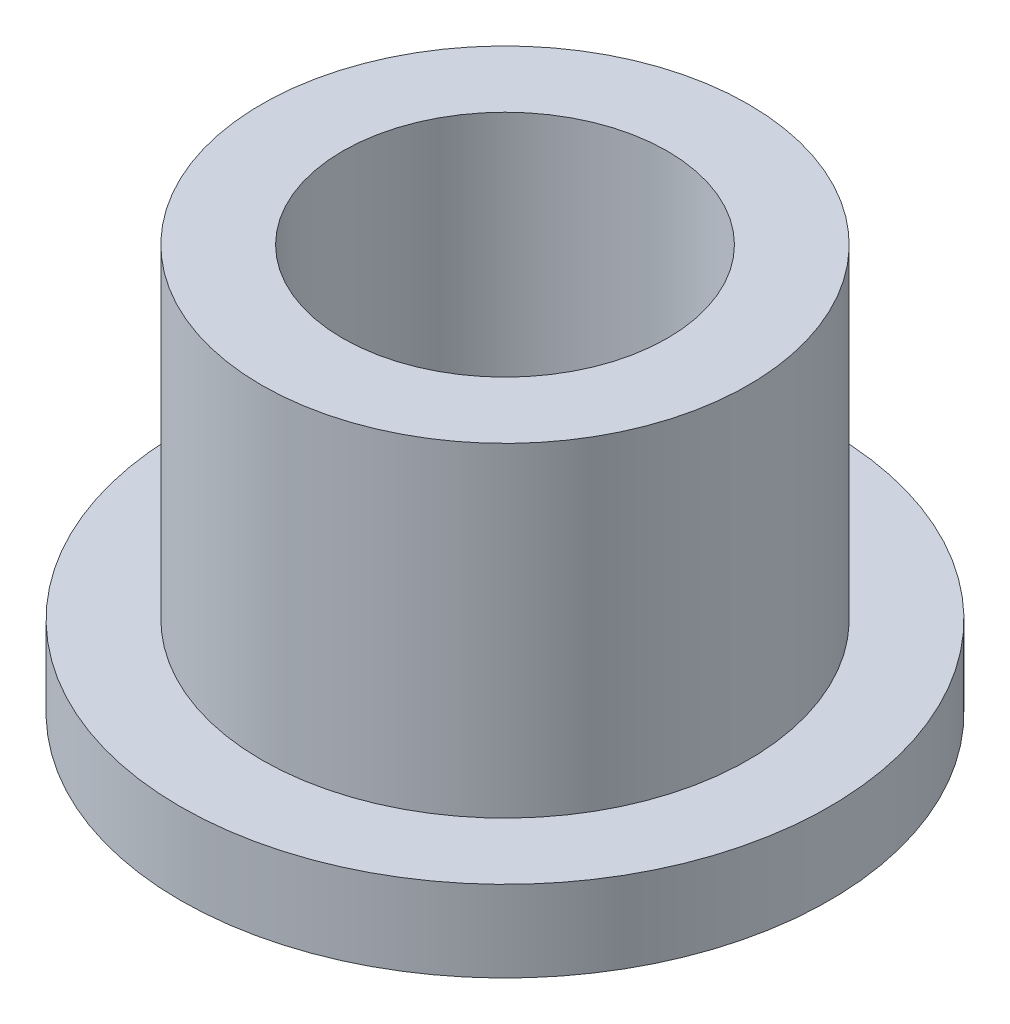
ISO-10303-21;
HEADER;
FILE_DESCRIPTION(('STEP AP214'),'2;1');
FILE_NAME('part.step','',(''),(''),'','','');
FILE_SCHEMA(('AUTOMOTIVE_DESIGN { 1 0 10303 214 1 1 1 1 }'));
ENDSEC;
DATA;
#1=APPLICATION_CONTEXT('core data for automotive mechanical design processes');
#2=APPLICATION_PROTOCOL_DEFINITION('international standard','automotive_design',2000,#1);
#3=PRODUCT_CONTEXT('',#1,'mechanical');
#4=PRODUCT('Part','Part','',(#3));
#5=PRODUCT_RELATED_PRODUCT_CATEGORY('part','',(#4));
#6=PRODUCT_DEFINITION_FORMATION('','',#4);
#7=PRODUCT_DEFINITION_CONTEXT('part definition',#1,'design');
#8=PRODUCT_DEFINITION('design','',#6,#7);
#9=PRODUCT_DEFINITION_SHAPE('','',#8);
#10=(LENGTH_UNIT() NAMED_UNIT(*) SI_UNIT(.MILLI.,.METRE.));
#11=(NAMED_UNIT(*) PLANE_ANGLE_UNIT() SI_UNIT($,.RADIAN.));
#12=(NAMED_UNIT(*) SI_UNIT($,.STERADIAN.) SOLID_ANGLE_UNIT());
#13=UNCERTAINTY_MEASURE_WITH_UNIT(LENGTH_MEASURE(1.E-05),#10,'distance_accuracy_value','');
#14=(GEOMETRIC_REPRESENTATION_CONTEXT(3) GLOBAL_UNCERTAINTY_ASSIGNED_CONTEXT((#13)) GLOBAL_UNIT_ASSIGNED_CONTEXT((#10,
#11,#12)) REPRESENTATION_CONTEXT('',''));
#15=CARTESIAN_POINT('',(0.,0.,0.));
#16=DIRECTION('',(0.,0.,1.));
#17=DIRECTION('',(1.,0.,0.));
#18=AXIS2_PLACEMENT_3D('',#15,#16,#17);
#19=CARTESIAN_POINT('',(0.,7.9375,0.));
#20=DIRECTION('',(0.,1.,0.));
#21=DIRECTION('',(0.,0.,1.));
#22=AXIS2_PLACEMENT_3D('',#19,#20,#21);
#23=PLANE('',#22);
#24=CARTESIAN_POINT('',(0.,7.9375,0.));
#25=DIRECTION('',(0.,1.,0.));
#26=DIRECTION('',(0.,0.,1.));
#27=AXIS2_PLACEMENT_3D('',#24,#25,#26);
#28=CIRCLE('',#27,4.7625);
#29=CARTESIAN_POINT('',(0.,7.9375,4.7625));
#30=VERTEX_POINT('',#29);
#31=EDGE_CURVE('E10',#30,#30,#28,.T.);
#32=ORIENTED_EDGE('',*,*,#31,.T.);
#33=EDGE_LOOP('',(#32));
#34=FACE_BOUND('',#33,.T.);
#35=CARTESIAN_POINT('',(0.,7.9375,0.));
#36=DIRECTION('',(0.,1.,0.));
#37=DIRECTION('',(0.,0.,1.));
#38=AXIS2_PLACEMENT_3D('',#35,#36,#37);
#39=CIRCLE('',#38,3.175);
#40=CARTESIAN_POINT('',(0.,7.9375,3.175));
#41=VERTEX_POINT('',#40);
#42=EDGE_CURVE('E37',#41,#41,#39,.T.);
#43=ORIENTED_EDGE('',*,*,#42,.F.);
#44=EDGE_LOOP('',(#43));
#45=FACE_BOUND('',#44,.T.);
#46=ADVANCED_FACE('F30',(#34,#45),#23,.T.);
#47=CARTESIAN_POINT('',(0.,0.,0.));
#48=DIRECTION('',(0.,1.,0.));
#49=DIRECTION('',(0.,0.,1.));
#50=AXIS2_PLACEMENT_3D('',#47,#48,#49);
#51=PLANE('',#50);
#52=CARTESIAN_POINT('',(0.,0.,0.));
#53=DIRECTION('',(0.,1.,0.));
#54=DIRECTION('',(0.,0.,1.));
#55=AXIS2_PLACEMENT_3D('',#52,#53,#54);
#56=CIRCLE('',#55,3.175);
#57=CARTESIAN_POINT('',(0.,0.,3.175));
#58=VERTEX_POINT('',#57);
#59=EDGE_CURVE('E41',#58,#58,#56,.T.);
#60=ORIENTED_EDGE('',*,*,#59,.T.);
#61=EDGE_LOOP('',(#60));
#62=FACE_BOUND('',#61,.T.);
#63=CARTESIAN_POINT('',(0.,0.,0.));
#64=DIRECTION('',(0.,1.,0.));
#65=DIRECTION('',(0.,0.,1.));
#66=AXIS2_PLACEMENT_3D('',#63,#64,#65);
#67=CIRCLE('',#66,6.35);
#68=CARTESIAN_POINT('',(0.,0.,6.35));
#69=VERTEX_POINT('',#68);
#70=EDGE_CURVE('E48',#69,#69,#67,.T.);
#71=ORIENTED_EDGE('',*,*,#70,.F.);
#72=EDGE_LOOP('',(#71));
#73=FACE_BOUND('',#72,.T.);
#74=ADVANCED_FACE('F73',(#62,#73),#51,.F.);
#75=CARTESIAN_POINT('',(0.,7.9375,0.));
#76=DIRECTION('',(0.,-1.,0.));
#77=DIRECTION('',(0.,0.,-1.));
#78=AXIS2_PLACEMENT_3D('',#75,#76,#77);
#79=CYLINDRICAL_SURFACE('',#78,4.7625);
#80=CARTESIAN_POINT('',(0.,1.5875,0.));
#81=DIRECTION('',(0.,1.,0.));
#82=DIRECTION('',(0.,0.,1.));
#83=AXIS2_PLACEMENT_3D('',#80,#81,#82);
#84=CIRCLE('',#83,4.7625);
#85=CARTESIAN_POINT('',(0.,1.5875,4.7625));
#86=VERTEX_POINT('',#85);
#87=EDGE_CURVE('E51',#86,#86,#84,.T.);
#88=ORIENTED_EDGE('',*,*,#87,.T.);
#89=EDGE_LOOP('',(#88));
#90=FACE_BOUND('',#89,.T.);
#91=ORIENTED_EDGE('',*,*,#31,.F.);
#92=EDGE_LOOP('',(#91));
#93=FACE_BOUND('',#92,.T.);
#94=ADVANCED_FACE('F32',(#90,#93),#79,.T.);
#95=CARTESIAN_POINT('',(0.,7.9375,0.));
#96=DIRECTION('',(0.,-1.,0.));
#97=DIRECTION('',(0.,0.,-1.));
#98=AXIS2_PLACEMENT_3D('',#95,#96,#97);
#99=CYLINDRICAL_SURFACE('',#98,3.175);
#100=ORIENTED_EDGE('',*,*,#42,.T.);
#101=EDGE_LOOP('',(#100));
#102=FACE_BOUND('',#101,.T.);
#103=ORIENTED_EDGE('',*,*,#59,.F.);
#104=EDGE_LOOP('',(#103));
#105=FACE_BOUND('',#104,.T.);
#106=ADVANCED_FACE('F62',(#102,#105),#99,.F.);
#107=CARTESIAN_POINT('',(0.,1.5875,0.));
#108=DIRECTION('',(0.,1.,0.));
#109=DIRECTION('',(0.,0.,1.));
#110=AXIS2_PLACEMENT_3D('',#107,#108,#109);
#111=PLANE('',#110);
#112=CARTESIAN_POINT('',(0.,1.5875,0.));
#113=DIRECTION('',(0.,1.,0.));
#114=DIRECTION('',(0.,0.,1.));
#115=AXIS2_PLACEMENT_3D('',#112,#113,#114);
#116=CIRCLE('',#115,6.35);
#117=CARTESIAN_POINT('',(0.,1.5875,6.35));
#118=VERTEX_POINT('',#117);
#119=EDGE_CURVE('E46',#118,#118,#116,.T.);
#120=ORIENTED_EDGE('',*,*,#119,.T.);
#121=EDGE_LOOP('',(#120));
#122=FACE_BOUND('',#121,.T.);
#123=ORIENTED_EDGE('',*,*,#87,.F.);
#124=EDGE_LOOP('',(#123));
#125=FACE_BOUND('',#124,.T.);
#126=ADVANCED_FACE('F59',(#122,#125),#111,.T.);
#127=CARTESIAN_POINT('',(0.,1.5875,0.));
#128=DIRECTION('',(0.,-1.,0.));
#129=DIRECTION('',(0.,0.,-1.));
#130=AXIS2_PLACEMENT_3D('',#127,#128,#129);
#131=CYLINDRICAL_SURFACE('',#130,6.35);
#132=ORIENTED_EDGE('',*,*,#119,.F.);
#133=EDGE_LOOP('',(#132));
#134=FACE_BOUND('',#133,.T.);
#135=ORIENTED_EDGE('',*,*,#70,.T.);
#136=EDGE_LOOP('',(#135));
#137=FACE_BOUND('',#136,.T.);
#138=ADVANCED_FACE('F61',(#134,#137),#131,.T.);
#139=CLOSED_SHELL('',(#46,#74,#94,#106,#126,#138));
#140=MANIFOLD_SOLID_BREP('B2',#139);
#141=ADVANCED_BREP_SHAPE_REPRESENTATION('',(#18,#140),#14);
#142=SHAPE_DEFINITION_REPRESENTATION(#9,#141);
ENDSEC;
END-ISO-10303-21;
